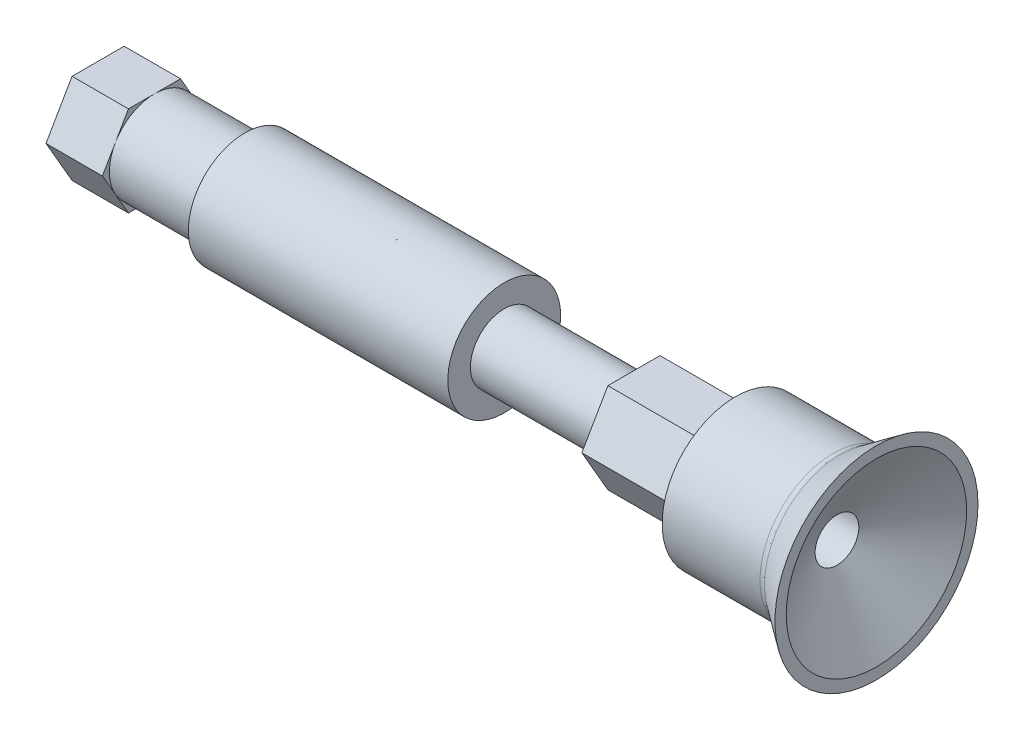
ISO-10303-21;
HEADER;
FILE_DESCRIPTION(('STEP AP214'),'2;1');
FILE_NAME('part.step','',(''),(''),'','','');
FILE_SCHEMA(('AUTOMOTIVE_DESIGN { 1 0 10303 214 1 1 1 1 }'));
ENDSEC;
DATA;
#1=APPLICATION_CONTEXT('core data for automotive mechanical design processes');
#2=APPLICATION_PROTOCOL_DEFINITION('international standard','automotive_design',2000,#1);
#3=PRODUCT_CONTEXT('',#1,'mechanical');
#4=PRODUCT('Part','Part','',(#3));
#5=PRODUCT_RELATED_PRODUCT_CATEGORY('part','',(#4));
#6=PRODUCT_DEFINITION_FORMATION('','',#4);
#7=PRODUCT_DEFINITION_CONTEXT('part definition',#1,'design');
#8=PRODUCT_DEFINITION('design','',#6,#7);
#9=PRODUCT_DEFINITION_SHAPE('','',#8);
#10=(LENGTH_UNIT() NAMED_UNIT(*) SI_UNIT(.MILLI.,.METRE.));
#11=(NAMED_UNIT(*) PLANE_ANGLE_UNIT() SI_UNIT($,.RADIAN.));
#12=(NAMED_UNIT(*) SI_UNIT($,.STERADIAN.) SOLID_ANGLE_UNIT());
#13=UNCERTAINTY_MEASURE_WITH_UNIT(LENGTH_MEASURE(1.E-05),#10,'distance_accuracy_value','');
#14=(GEOMETRIC_REPRESENTATION_CONTEXT(3) GLOBAL_UNCERTAINTY_ASSIGNED_CONTEXT((#13)) GLOBAL_UNIT_ASSIGNED_CONTEXT((#10,
#11,#12)) REPRESENTATION_CONTEXT('',''));
#15=CARTESIAN_POINT('',(0.,0.,0.));
#16=DIRECTION('',(0.,0.,1.));
#17=DIRECTION('',(1.,0.,0.));
#18=AXIS2_PLACEMENT_3D('',#15,#16,#17);
#19=CARTESIAN_POINT('',(36.,0.,0.));
#20=DIRECTION('',(1.,0.,0.));
#21=DIRECTION('',(0.,0.,-1.));
#22=AXIS2_PLACEMENT_3D('',#19,#20,#21);
#23=PLANE('',#22);
#24=CARTESIAN_POINT('',(36.,0.,0.));
#25=DIRECTION('',(1.,0.,0.));
#26=DIRECTION('',(0.,0.,-1.));
#27=AXIS2_PLACEMENT_3D('',#24,#25,#26);
#28=CIRCLE('',#27,5.);
#29=CARTESIAN_POINT('',(36.,0.,-5.));
#30=VERTEX_POINT('',#29);
#31=EDGE_CURVE('E208',#30,#30,#28,.T.);
#32=ORIENTED_EDGE('',*,*,#31,.T.);
#33=EDGE_LOOP('',(#32));
#34=FACE_BOUND('',#33,.T.);
#35=CARTESIAN_POINT('',(36.,0.,0.));
#36=DIRECTION('',(1.,0.,0.));
#37=DIRECTION('',(0.,0.,-1.));
#38=AXIS2_PLACEMENT_3D('',#35,#36,#37);
#39=CIRCLE('',#38,3.);
#40=CARTESIAN_POINT('',(36.,0.,-3.));
#41=VERTEX_POINT('',#40);
#42=EDGE_CURVE('E201',#41,#41,#39,.T.);
#43=ORIENTED_EDGE('',*,*,#42,.F.);
#44=EDGE_LOOP('',(#43));
#45=FACE_BOUND('',#44,.T.);
#46=ADVANCED_FACE('F37',(#34,#45),#23,.T.);
#47=CARTESIAN_POINT('',(5.,0.,0.));
#48=DIRECTION('',(1.,0.,0.));
#49=DIRECTION('',(0.,0.,-1.));
#50=AXIS2_PLACEMENT_3D('',#47,#48,#49);
#51=PLANE('',#50);
#52=CARTESIAN_POINT('',(5.,0.,0.));
#53=DIRECTION('',(1.,0.,0.));
#54=DIRECTION('',(0.,0.,-1.));
#55=AXIS2_PLACEMENT_3D('',#52,#53,#54);
#56=CIRCLE('',#55,4.);
#57=CARTESIAN_POINT('',(5.,2.,-3.46410161513776));
#58=VERTEX_POINT('',#57);
#59=CARTESIAN_POINT('',(5.,4.,0.));
#60=VERTEX_POINT('',#59);
#61=EDGE_CURVE('E211',#58,#60,#56,.T.);
#62=ORIENTED_EDGE('',*,*,#61,.F.);
#63=DIRECTION('',(0.,0.866025403784439,0.5));
#64=VECTOR('',#63,1.);
#65=CARTESIAN_POINT('',(5.,0.,-4.618802153517));
#66=LINE('',#65,#64);
#67=CARTESIAN_POINT('',(5.,4.,-2.3094010767585));
#68=VERTEX_POINT('',#67);
#69=EDGE_CURVE('E224',#58,#68,#66,.T.);
#70=ORIENTED_EDGE('',*,*,#69,.T.);
#71=DIRECTION('',(0.,0.,1.));
#72=VECTOR('',#71,1.);
#73=CARTESIAN_POINT('',(5.,4.,-2.3094010767585));
#74=LINE('',#73,#72);
#75=EDGE_CURVE('E225',#68,#60,#74,.T.);
#76=ORIENTED_EDGE('',*,*,#75,.T.);
#77=EDGE_LOOP('',(#62,#70,#76));
#78=FACE_BOUND('',#77,.T.);
#79=ADVANCED_FACE('F284',(#78),#51,.T.);
#80=CARTESIAN_POINT('',(5.,2.,3.46410161513775));
#81=VERTEX_POINT('',#80);
#82=EDGE_CURVE('E220',#60,#81,#56,.T.);
#83=ORIENTED_EDGE('',*,*,#82,.F.);
#84=CARTESIAN_POINT('',(5.,4.,2.3094010767585));
#85=VERTEX_POINT('',#84);
#86=EDGE_CURVE('E223',#60,#85,#74,.T.);
#87=ORIENTED_EDGE('',*,*,#86,.T.);
#88=DIRECTION('',(0.,-0.866025403784439,0.5));
#89=VECTOR('',#88,1.);
#90=CARTESIAN_POINT('',(5.,4.,2.3094010767585));
#91=LINE('',#90,#89);
#92=EDGE_CURVE('E229',#85,#81,#91,.T.);
#93=ORIENTED_EDGE('',*,*,#92,.T.);
#94=EDGE_LOOP('',(#83,#87,#93));
#95=FACE_BOUND('',#94,.T.);
#96=ADVANCED_FACE('F309',(#95),#51,.T.);
#97=CARTESIAN_POINT('',(5.,-2.,3.46410161513775));
#98=VERTEX_POINT('',#97);
#99=EDGE_CURVE('E276',#81,#98,#56,.T.);
#100=ORIENTED_EDGE('',*,*,#99,.F.);
#101=CARTESIAN_POINT('',(5.,0.,4.618802153517));
#102=VERTEX_POINT('',#101);
#103=EDGE_CURVE('E228',#81,#102,#91,.T.);
#104=ORIENTED_EDGE('',*,*,#103,.T.);
#105=DIRECTION('',(0.,-0.866025403784439,-0.5));
#106=VECTOR('',#105,1.);
#107=CARTESIAN_POINT('',(5.,0.,4.618802153517));
#108=LINE('',#107,#106);
#109=EDGE_CURVE('E233',#102,#98,#108,.T.);
#110=ORIENTED_EDGE('',*,*,#109,.T.);
#111=EDGE_LOOP('',(#100,#104,#110));
#112=FACE_BOUND('',#111,.T.);
#113=ADVANCED_FACE('F311',(#112),#51,.T.);
#114=CARTESIAN_POINT('',(5.,-4.,0.));
#115=VERTEX_POINT('',#114);
#116=EDGE_CURVE('E279',#98,#115,#56,.T.);
#117=ORIENTED_EDGE('',*,*,#116,.F.);
#118=CARTESIAN_POINT('',(5.,-4.,2.3094010767585));
#119=VERTEX_POINT('',#118);
#120=EDGE_CURVE('E232',#98,#119,#108,.T.);
#121=ORIENTED_EDGE('',*,*,#120,.T.);
#122=DIRECTION('',(0.,0.,-1.));
#123=VECTOR('',#122,1.);
#124=CARTESIAN_POINT('',(5.,-4.,2.3094010767585));
#125=LINE('',#124,#123);
#126=EDGE_CURVE('E237',#119,#115,#125,.T.);
#127=ORIENTED_EDGE('',*,*,#126,.T.);
#128=EDGE_LOOP('',(#117,#121,#127));
#129=FACE_BOUND('',#128,.T.);
#130=ADVANCED_FACE('F317',(#129),#51,.T.);
#131=CARTESIAN_POINT('',(5.,-2.,-3.46410161513775));
#132=VERTEX_POINT('',#131);
#133=EDGE_CURVE('E60',#115,#132,#56,.T.);
#134=ORIENTED_EDGE('',*,*,#133,.F.);
#135=CARTESIAN_POINT('',(5.,-4.,-2.3094010767585));
#136=VERTEX_POINT('',#135);
#137=EDGE_CURVE('E236',#115,#136,#125,.T.);
#138=ORIENTED_EDGE('',*,*,#137,.T.);
#139=DIRECTION('',(0.,0.866025403784439,-0.5));
#140=VECTOR('',#139,1.);
#141=CARTESIAN_POINT('',(5.,-4.,-2.3094010767585));
#142=LINE('',#141,#140);
#143=EDGE_CURVE('E241',#136,#132,#142,.T.);
#144=ORIENTED_EDGE('',*,*,#143,.T.);
#145=EDGE_LOOP('',(#134,#138,#144));
#146=FACE_BOUND('',#145,.T.);
#147=ADVANCED_FACE('F351',(#146),#51,.T.);
#148=CARTESIAN_POINT('',(5.,0.,-4.618802153517));
#149=DIRECTION('',(0.,-0.5,0.866025403784439));
#150=DIRECTION('',(0.,-0.866025403784439,-0.5));
#151=AXIS2_PLACEMENT_3D('',#148,#149,#150);
#152=PLANE('',#151);
#153=DIRECTION('',(0.,0.866025403784439,0.5));
#154=VECTOR('',#153,1.);
#155=CARTESIAN_POINT('',(0.,0.,-4.618802153517));
#156=LINE('',#155,#154);
#157=CARTESIAN_POINT('',(0.,0.,-4.618802153517));
#158=VERTEX_POINT('',#157);
#159=CARTESIAN_POINT('',(0.,4.,-2.3094010767585));
#160=VERTEX_POINT('',#159);
#161=EDGE_CURVE('E217',#158,#160,#156,.T.);
#162=ORIENTED_EDGE('',*,*,#161,.T.);
#163=DIRECTION('',(-1.,0.,0.));
#164=VECTOR('',#163,1.);
#165=CARTESIAN_POINT('',(5.,4.,-2.3094010767585));
#166=LINE('',#165,#164);
#167=EDGE_CURVE('E270',#68,#160,#166,.T.);
#168=ORIENTED_EDGE('',*,*,#167,.F.);
#169=ORIENTED_EDGE('',*,*,#69,.F.);
#170=CARTESIAN_POINT('',(5.,0.,-4.618802153517));
#171=VERTEX_POINT('',#170);
#172=EDGE_CURVE('E221',#171,#58,#66,.T.);
#173=ORIENTED_EDGE('',*,*,#172,.F.);
#174=DIRECTION('',(-1.,0.,0.));
#175=VECTOR('',#174,1.);
#176=CARTESIAN_POINT('',(5.,0.,-4.618802153517));
#177=LINE('',#176,#175);
#178=EDGE_CURVE('E243',#171,#158,#177,.T.);
#179=ORIENTED_EDGE('',*,*,#178,.T.);
#180=EDGE_LOOP('',(#162,#168,#169,#173,#179));
#181=FACE_BOUND('',#180,.T.);
#182=ADVANCED_FACE('F293',(#181),#152,.F.);
#183=CARTESIAN_POINT('',(5.,4.,-2.3094010767585));
#184=DIRECTION('',(0.,-1.,0.));
#185=DIRECTION('',(0.,0.,-1.));
#186=AXIS2_PLACEMENT_3D('',#183,#184,#185);
#187=PLANE('',#186);
#188=DIRECTION('',(0.,0.,1.));
#189=VECTOR('',#188,1.);
#190=CARTESIAN_POINT('',(0.,4.,-2.3094010767585));
#191=LINE('',#190,#189);
#192=CARTESIAN_POINT('',(0.,4.,2.3094010767585));
#193=VERTEX_POINT('',#192);
#194=EDGE_CURVE('E246',#160,#193,#191,.T.);
#195=ORIENTED_EDGE('',*,*,#194,.T.);
#196=DIRECTION('',(-1.,0.,0.));
#197=VECTOR('',#196,1.);
#198=CARTESIAN_POINT('',(5.,4.,2.3094010767585));
#199=LINE('',#198,#197);
#200=EDGE_CURVE('E267',#85,#193,#199,.T.);
#201=ORIENTED_EDGE('',*,*,#200,.F.);
#202=ORIENTED_EDGE('',*,*,#86,.F.);
#203=ORIENTED_EDGE('',*,*,#75,.F.);
#204=ORIENTED_EDGE('',*,*,#167,.T.);
#205=EDGE_LOOP('',(#195,#201,#202,#203,#204));
#206=FACE_BOUND('',#205,.T.);
#207=ADVANCED_FACE('F290',(#206),#187,.F.);
#208=CARTESIAN_POINT('',(5.,4.,2.3094010767585));
#209=DIRECTION('',(0.,-0.5,-0.866025403784439));
#210=DIRECTION('',(0.,0.866025403784439,-0.5));
#211=AXIS2_PLACEMENT_3D('',#208,#209,#210);
#212=PLANE('',#211);
#213=DIRECTION('',(0.,-0.866025403784439,0.5));
#214=VECTOR('',#213,1.);
#215=CARTESIAN_POINT('',(0.,4.,2.3094010767585));
#216=LINE('',#215,#214);
#217=CARTESIAN_POINT('',(0.,0.,4.618802153517));
#218=VERTEX_POINT('',#217);
#219=EDGE_CURVE('E248',#193,#218,#216,.T.);
#220=ORIENTED_EDGE('',*,*,#219,.T.);
#221=DIRECTION('',(-1.,0.,0.));
#222=VECTOR('',#221,1.);
#223=CARTESIAN_POINT('',(5.,0.,4.618802153517));
#224=LINE('',#223,#222);
#225=EDGE_CURVE('E264',#102,#218,#224,.T.);
#226=ORIENTED_EDGE('',*,*,#225,.F.);
#227=ORIENTED_EDGE('',*,*,#103,.F.);
#228=ORIENTED_EDGE('',*,*,#92,.F.);
#229=ORIENTED_EDGE('',*,*,#200,.T.);
#230=EDGE_LOOP('',(#220,#226,#227,#228,#229));
#231=FACE_BOUND('',#230,.T.);
#232=ADVANCED_FACE('F305',(#231),#212,.F.);
#233=CARTESIAN_POINT('',(5.,0.,4.618802153517));
#234=DIRECTION('',(0.,0.5,-0.866025403784439));
#235=DIRECTION('',(0.,0.866025403784439,0.5));
#236=AXIS2_PLACEMENT_3D('',#233,#234,#235);
#237=PLANE('',#236);
#238=DIRECTION('',(0.,-0.866025403784439,-0.5));
#239=VECTOR('',#238,1.);
#240=CARTESIAN_POINT('',(0.,0.,4.618802153517));
#241=LINE('',#240,#239);
#242=CARTESIAN_POINT('',(0.,-4.,2.3094010767585));
#243=VERTEX_POINT('',#242);
#244=EDGE_CURVE('E250',#218,#243,#241,.T.);
#245=ORIENTED_EDGE('',*,*,#244,.T.);
#246=DIRECTION('',(-1.,0.,0.));
#247=VECTOR('',#246,1.);
#248=CARTESIAN_POINT('',(5.,-4.,2.3094010767585));
#249=LINE('',#248,#247);
#250=EDGE_CURVE('E261',#119,#243,#249,.T.);
#251=ORIENTED_EDGE('',*,*,#250,.F.);
#252=ORIENTED_EDGE('',*,*,#120,.F.);
#253=ORIENTED_EDGE('',*,*,#109,.F.);
#254=ORIENTED_EDGE('',*,*,#225,.T.);
#255=EDGE_LOOP('',(#245,#251,#252,#253,#254));
#256=FACE_BOUND('',#255,.T.);
#257=ADVANCED_FACE('F360',(#256),#237,.F.);
#258=CARTESIAN_POINT('',(5.,-4.,2.3094010767585));
#259=DIRECTION('',(0.,1.,0.));
#260=DIRECTION('',(0.,0.,1.));
#261=AXIS2_PLACEMENT_3D('',#258,#259,#260);
#262=PLANE('',#261);
#263=DIRECTION('',(0.,0.,-1.));
#264=VECTOR('',#263,1.);
#265=CARTESIAN_POINT('',(0.,-4.,2.3094010767585));
#266=LINE('',#265,#264);
#267=CARTESIAN_POINT('',(0.,-4.,-2.3094010767585));
#268=VERTEX_POINT('',#267);
#269=EDGE_CURVE('E252',#243,#268,#266,.T.);
#270=ORIENTED_EDGE('',*,*,#269,.T.);
#271=DIRECTION('',(-1.,0.,0.));
#272=VECTOR('',#271,1.);
#273=CARTESIAN_POINT('',(5.,-4.,-2.3094010767585));
#274=LINE('',#273,#272);
#275=EDGE_CURVE('E258',#136,#268,#274,.T.);
#276=ORIENTED_EDGE('',*,*,#275,.F.);
#277=ORIENTED_EDGE('',*,*,#137,.F.);
#278=ORIENTED_EDGE('',*,*,#126,.F.);
#279=ORIENTED_EDGE('',*,*,#250,.T.);
#280=EDGE_LOOP('',(#270,#276,#277,#278,#279));
#281=FACE_BOUND('',#280,.T.);
#282=ADVANCED_FACE('F356',(#281),#262,.F.);
#283=CARTESIAN_POINT('',(5.,-4.,-2.3094010767585));
#284=DIRECTION('',(0.,0.5,0.866025403784439));
#285=DIRECTION('',(0.,-0.866025403784439,0.5));
#286=AXIS2_PLACEMENT_3D('',#283,#284,#285);
#287=PLANE('',#286);
#288=DIRECTION('',(0.,0.866025403784439,-0.5));
#289=VECTOR('',#288,1.);
#290=CARTESIAN_POINT('',(0.,-4.,-2.3094010767585));
#291=LINE('',#290,#289);
#292=EDGE_CURVE('E254',#268,#158,#291,.T.);
#293=ORIENTED_EDGE('',*,*,#292,.T.);
#294=ORIENTED_EDGE('',*,*,#178,.F.);
#295=EDGE_CURVE('E240',#132,#171,#142,.T.);
#296=ORIENTED_EDGE('',*,*,#295,.F.);
#297=ORIENTED_EDGE('',*,*,#143,.F.);
#298=ORIENTED_EDGE('',*,*,#275,.T.);
#299=EDGE_LOOP('',(#293,#294,#296,#297,#298));
#300=FACE_BOUND('',#299,.T.);
#301=ADVANCED_FACE('F350',(#300),#287,.F.);
#302=EDGE_CURVE('E52',#132,#58,#56,.T.);
#303=ORIENTED_EDGE('',*,*,#302,.F.);
#304=ORIENTED_EDGE('',*,*,#295,.T.);
#305=ORIENTED_EDGE('',*,*,#172,.T.);
#306=EDGE_LOOP('',(#303,#304,#305));
#307=FACE_BOUND('',#306,.T.);
#308=ADVANCED_FACE('F319',(#307),#51,.T.);
#309=CARTESIAN_POINT('',(0.,0.,0.));
#310=DIRECTION('',(1.,0.,0.));
#311=DIRECTION('',(0.,0.,-1.));
#312=AXIS2_PLACEMENT_3D('',#309,#310,#311);
#313=PLANE('',#312);
#314=CARTESIAN_POINT('',(0.,0.,0.));
#315=DIRECTION('',(-1.,0.,0.));
#316=DIRECTION('',(0.,0.,1.));
#317=AXIS2_PLACEMENT_3D('',#314,#315,#316);
#318=CIRCLE('',#317,2.5);
#319=CARTESIAN_POINT('',(0.,0.,2.5));
#320=VERTEX_POINT('',#319);
#321=EDGE_CURVE('E627',#320,#320,#318,.T.);
#322=ORIENTED_EDGE('',*,*,#321,.F.);
#323=EDGE_LOOP('',(#322));
#324=FACE_BOUND('',#323,.T.);
#325=ORIENTED_EDGE('',*,*,#161,.F.);
#326=ORIENTED_EDGE('',*,*,#292,.F.);
#327=ORIENTED_EDGE('',*,*,#269,.F.);
#328=ORIENTED_EDGE('',*,*,#244,.F.);
#329=ORIENTED_EDGE('',*,*,#219,.F.);
#330=ORIENTED_EDGE('',*,*,#194,.F.);
#331=EDGE_LOOP('',(#325,#326,#327,#328,#329,#330));
#332=FACE_BOUND('',#331,.T.);
#333=ADVANCED_FACE('F299',(#324,#332),#313,.F.);
#334=CARTESIAN_POINT('',(13.,0.,0.));
#335=DIRECTION('',(-1.,0.,0.));
#336=DIRECTION('',(0.,0.,1.));
#337=AXIS2_PLACEMENT_3D('',#334,#335,#336);
#338=CYLINDRICAL_SURFACE('',#337,4.);
#339=CARTESIAN_POINT('',(13.,0.,0.));
#340=DIRECTION('',(1.,0.,0.));
#341=DIRECTION('',(0.,0.,-1.));
#342=AXIS2_PLACEMENT_3D('',#339,#340,#341);
#343=CIRCLE('',#342,4.);
#344=CARTESIAN_POINT('',(13.,0.,-4.));
#345=VERTEX_POINT('',#344);
#346=EDGE_CURVE('E214',#345,#345,#343,.T.);
#347=ORIENTED_EDGE('',*,*,#346,.F.);
#348=EDGE_LOOP('',(#347));
#349=FACE_BOUND('',#348,.T.);
#350=ORIENTED_EDGE('',*,*,#61,.T.);
#351=ORIENTED_EDGE('',*,*,#82,.T.);
#352=ORIENTED_EDGE('',*,*,#99,.T.);
#353=ORIENTED_EDGE('',*,*,#116,.T.);
#354=ORIENTED_EDGE('',*,*,#133,.T.);
#355=ORIENTED_EDGE('',*,*,#302,.T.);
#356=EDGE_LOOP('',(#350,#351,#352,#353,#354,#355));
#357=FACE_BOUND('',#356,.T.);
#358=ADVANCED_FACE('F281',(#349,#357),#338,.T.);
#359=CARTESIAN_POINT('',(13.,0.,0.));
#360=DIRECTION('',(1.,0.,0.));
#361=DIRECTION('',(0.,0.,-1.));
#362=AXIS2_PLACEMENT_3D('',#359,#360,#361);
#363=PLANE('',#362);
#364=CARTESIAN_POINT('',(13.,0.,0.));
#365=DIRECTION('',(1.,0.,0.));
#366=DIRECTION('',(0.,0.,-1.));
#367=AXIS2_PLACEMENT_3D('',#364,#365,#366);
#368=CIRCLE('',#367,5.);
#369=CARTESIAN_POINT('',(13.,0.,-5.));
#370=VERTEX_POINT('',#369);
#371=EDGE_CURVE('E205',#370,#370,#368,.T.);
#372=ORIENTED_EDGE('',*,*,#371,.F.);
#373=EDGE_LOOP('',(#372));
#374=FACE_BOUND('',#373,.T.);
#375=ORIENTED_EDGE('',*,*,#346,.T.);
#376=EDGE_LOOP('',(#375));
#377=FACE_BOUND('',#376,.T.);
#378=ADVANCED_FACE('F332',(#374,#377),#363,.F.);
#379=CARTESIAN_POINT('',(36.,0.,0.));
#380=DIRECTION('',(-1.,0.,0.));
#381=DIRECTION('',(0.,0.,1.));
#382=AXIS2_PLACEMENT_3D('',#379,#380,#381);
#383=CYLINDRICAL_SURFACE('',#382,5.);
#384=ORIENTED_EDGE('',*,*,#31,.F.);
#385=EDGE_LOOP('',(#384));
#386=FACE_BOUND('',#385,.T.);
#387=ORIENTED_EDGE('',*,*,#371,.T.);
#388=EDGE_LOOP('',(#387));
#389=FACE_BOUND('',#388,.T.);
#390=ADVANCED_FACE('F335',(#386,#389),#383,.T.);
#391=CARTESIAN_POINT('',(47.5,0.,0.));
#392=DIRECTION('',(-1.,0.,0.));
#393=DIRECTION('',(0.,0.,1.));
#394=AXIS2_PLACEMENT_3D('',#391,#392,#393);
#395=CYLINDRICAL_SURFACE('',#394,3.);
#396=CARTESIAN_POINT('',(47.5,0.,0.));
#397=DIRECTION('',(1.,0.,0.));
#398=DIRECTION('',(0.,0.,-1.));
#399=AXIS2_PLACEMENT_3D('',#396,#397,#398);
#400=CIRCLE('',#399,3.);
#401=CARTESIAN_POINT('',(47.5,0.,-3.));
#402=VERTEX_POINT('',#401);
#403=EDGE_CURVE('E202',#402,#402,#400,.T.);
#404=ORIENTED_EDGE('',*,*,#403,.F.);
#405=EDGE_LOOP('',(#404));
#406=FACE_BOUND('',#405,.T.);
#407=ORIENTED_EDGE('',*,*,#42,.T.);
#408=EDGE_LOOP('',(#407));
#409=FACE_BOUND('',#408,.T.);
#410=ADVANCED_FACE('F330',(#406,#409),#395,.T.);
#411=CARTESIAN_POINT('',(47.5,0.,0.));
#412=DIRECTION('',(1.,0.,0.));
#413=DIRECTION('',(0.,0.,-1.));
#414=AXIS2_PLACEMENT_3D('',#411,#412,#413);
#415=PLANE('',#414);
#416=DIRECTION('',(0.,0.866025403784439,0.5));
#417=VECTOR('',#416,1.);
#418=CARTESIAN_POINT('',(47.5,0.,-4.618802153517));
#419=LINE('',#418,#417);
#420=CARTESIAN_POINT('',(47.5,0.,-4.618802153517));
#421=VERTEX_POINT('',#420);
#422=CARTESIAN_POINT('',(47.5,4.,-2.3094010767585));
#423=VERTEX_POINT('',#422);
#424=EDGE_CURVE('E178',#421,#423,#419,.T.);
#425=ORIENTED_EDGE('',*,*,#424,.F.);
#426=DIRECTION('',(0.,0.866025403784439,-0.5));
#427=VECTOR('',#426,1.);
#428=CARTESIAN_POINT('',(47.5,-4.,-2.3094010767585));
#429=LINE('',#428,#427);
#430=CARTESIAN_POINT('',(47.5,-4.,-2.3094010767585));
#431=VERTEX_POINT('',#430);
#432=EDGE_CURVE('E158',#431,#421,#429,.T.);
#433=ORIENTED_EDGE('',*,*,#432,.F.);
#434=DIRECTION('',(0.,0.,-1.));
#435=VECTOR('',#434,1.);
#436=CARTESIAN_POINT('',(47.5,-4.,2.3094010767585));
#437=LINE('',#436,#435);
#438=CARTESIAN_POINT('',(47.5,-4.,2.3094010767585));
#439=VERTEX_POINT('',#438);
#440=EDGE_CURVE('E187',#439,#431,#437,.T.);
#441=ORIENTED_EDGE('',*,*,#440,.F.);
#442=DIRECTION('',(0.,-0.866025403784439,-0.5));
#443=VECTOR('',#442,1.);
#444=CARTESIAN_POINT('',(47.5,0.,4.618802153517));
#445=LINE('',#444,#443);
#446=CARTESIAN_POINT('',(47.5,0.,4.618802153517));
#447=VERTEX_POINT('',#446);
#448=EDGE_CURVE('E185',#447,#439,#445,.T.);
#449=ORIENTED_EDGE('',*,*,#448,.F.);
#450=DIRECTION('',(0.,-0.866025403784439,0.5));
#451=VECTOR('',#450,1.);
#452=CARTESIAN_POINT('',(47.5,4.,2.3094010767585));
#453=LINE('',#452,#451);
#454=CARTESIAN_POINT('',(47.5,4.,2.3094010767585));
#455=VERTEX_POINT('',#454);
#456=EDGE_CURVE('E183',#455,#447,#453,.T.);
#457=ORIENTED_EDGE('',*,*,#456,.F.);
#458=DIRECTION('',(0.,0.,1.));
#459=VECTOR('',#458,1.);
#460=CARTESIAN_POINT('',(47.5,4.,-2.3094010767585));
#461=LINE('',#460,#459);
#462=EDGE_CURVE('E180',#423,#455,#461,.T.);
#463=ORIENTED_EDGE('',*,*,#462,.F.);
#464=EDGE_LOOP('',(#425,#433,#441,#449,#457,#463));
#465=FACE_BOUND('',#464,.T.);
#466=ORIENTED_EDGE('',*,*,#403,.T.);
#467=EDGE_LOOP('',(#466));
#468=FACE_BOUND('',#467,.T.);
#469=ADVANCED_FACE('F428',(#465,#468),#415,.F.);
#470=CARTESIAN_POINT('',(56.5,0.,-4.618802153517));
#471=DIRECTION('',(0.,-0.5,0.866025403784439));
#472=DIRECTION('',(0.,-0.866025403784439,-0.5));
#473=AXIS2_PLACEMENT_3D('',#470,#471,#472);
#474=PLANE('',#473);
#475=ORIENTED_EDGE('',*,*,#424,.T.);
#476=DIRECTION('',(-1.,0.,0.));
#477=VECTOR('',#476,1.);
#478=CARTESIAN_POINT('',(56.5,4.,-2.3094010767585));
#479=LINE('',#478,#477);
#480=CARTESIAN_POINT('',(56.5,4.,-2.3094010767585));
#481=VERTEX_POINT('',#480);
#482=EDGE_CURVE('E153',#481,#423,#479,.T.);
#483=ORIENTED_EDGE('',*,*,#482,.F.);
#484=DIRECTION('',(0.,0.866025403784439,0.5));
#485=VECTOR('',#484,1.);
#486=CARTESIAN_POINT('',(56.5,0.,-4.618802153517));
#487=LINE('',#486,#485);
#488=CARTESIAN_POINT('',(56.5,0.,-4.618802153517));
#489=VERTEX_POINT('',#488);
#490=EDGE_CURVE('E146',#489,#481,#487,.T.);
#491=ORIENTED_EDGE('',*,*,#490,.F.);
#492=DIRECTION('',(-1.,0.,0.));
#493=VECTOR('',#492,1.);
#494=CARTESIAN_POINT('',(56.5,0.,-4.618802153517));
#495=LINE('',#494,#493);
#496=EDGE_CURVE('E150',#489,#421,#495,.T.);
#497=ORIENTED_EDGE('',*,*,#496,.T.);
#498=EDGE_LOOP('',(#475,#483,#491,#497));
#499=FACE_BOUND('',#498,.T.);
#500=ADVANCED_FACE('F149',(#499),#474,.F.);
#501=CARTESIAN_POINT('',(56.5,4.,-2.3094010767585));
#502=DIRECTION('',(0.,-1.,0.));
#503=DIRECTION('',(0.,0.,-1.));
#504=AXIS2_PLACEMENT_3D('',#501,#502,#503);
#505=PLANE('',#504);
#506=ORIENTED_EDGE('',*,*,#462,.T.);
#507=DIRECTION('',(-1.,0.,0.));
#508=VECTOR('',#507,1.);
#509=CARTESIAN_POINT('',(56.5,4.,2.3094010767585));
#510=LINE('',#509,#508);
#511=CARTESIAN_POINT('',(56.5,4.,2.3094010767585));
#512=VERTEX_POINT('',#511);
#513=EDGE_CURVE('E197',#512,#455,#510,.T.);
#514=ORIENTED_EDGE('',*,*,#513,.F.);
#515=DIRECTION('',(0.,0.,1.));
#516=VECTOR('',#515,1.);
#517=CARTESIAN_POINT('',(56.5,4.,-2.3094010767585));
#518=LINE('',#517,#516);
#519=EDGE_CURVE('E157',#481,#512,#518,.T.);
#520=ORIENTED_EDGE('',*,*,#519,.F.);
#521=ORIENTED_EDGE('',*,*,#482,.T.);
#522=EDGE_LOOP('',(#506,#514,#520,#521));
#523=FACE_BOUND('',#522,.T.);
#524=ADVANCED_FACE('F444',(#523),#505,.F.);
#525=CARTESIAN_POINT('',(56.5,4.,2.3094010767585));
#526=DIRECTION('',(0.,-0.5,-0.866025403784439));
#527=DIRECTION('',(0.,0.866025403784439,-0.5));
#528=AXIS2_PLACEMENT_3D('',#525,#526,#527);
#529=PLANE('',#528);
#530=ORIENTED_EDGE('',*,*,#456,.T.);
#531=DIRECTION('',(-1.,0.,0.));
#532=VECTOR('',#531,1.);
#533=CARTESIAN_POINT('',(56.5,0.,4.618802153517));
#534=LINE('',#533,#532);
#535=CARTESIAN_POINT('',(56.5,0.,4.618802153517));
#536=VERTEX_POINT('',#535);
#537=EDGE_CURVE('E194',#536,#447,#534,.T.);
#538=ORIENTED_EDGE('',*,*,#537,.F.);
#539=DIRECTION('',(0.,-0.866025403784439,0.5));
#540=VECTOR('',#539,1.);
#541=CARTESIAN_POINT('',(56.5,4.,2.3094010767585));
#542=LINE('',#541,#540);
#543=EDGE_CURVE('E633',#512,#536,#542,.T.);
#544=ORIENTED_EDGE('',*,*,#543,.F.);
#545=ORIENTED_EDGE('',*,*,#513,.T.);
#546=EDGE_LOOP('',(#530,#538,#544,#545));
#547=FACE_BOUND('',#546,.T.);
#548=ADVANCED_FACE('F452',(#547),#529,.F.);
#549=CARTESIAN_POINT('',(56.5,0.,4.618802153517));
#550=DIRECTION('',(0.,0.5,-0.866025403784439));
#551=DIRECTION('',(0.,0.866025403784439,0.5));
#552=AXIS2_PLACEMENT_3D('',#549,#550,#551);
#553=PLANE('',#552);
#554=ORIENTED_EDGE('',*,*,#448,.T.);
#555=DIRECTION('',(-1.,0.,0.));
#556=VECTOR('',#555,1.);
#557=CARTESIAN_POINT('',(56.5,-4.,2.3094010767585));
#558=LINE('',#557,#556);
#559=CARTESIAN_POINT('',(56.5,-4.,2.3094010767585));
#560=VERTEX_POINT('',#559);
#561=EDGE_CURVE('E191',#560,#439,#558,.T.);
#562=ORIENTED_EDGE('',*,*,#561,.F.);
#563=DIRECTION('',(0.,-0.866025403784439,-0.5));
#564=VECTOR('',#563,1.);
#565=CARTESIAN_POINT('',(56.5,0.,4.618802153517));
#566=LINE('',#565,#564);
#567=EDGE_CURVE('E174',#536,#560,#566,.T.);
#568=ORIENTED_EDGE('',*,*,#567,.F.);
#569=ORIENTED_EDGE('',*,*,#537,.T.);
#570=EDGE_LOOP('',(#554,#562,#568,#569));
#571=FACE_BOUND('',#570,.T.);
#572=ADVANCED_FACE('F461',(#571),#553,.F.);
#573=CARTESIAN_POINT('',(56.5,-4.,2.3094010767585));
#574=DIRECTION('',(0.,1.,0.));
#575=DIRECTION('',(0.,0.,1.));
#576=AXIS2_PLACEMENT_3D('',#573,#574,#575);
#577=PLANE('',#576);
#578=ORIENTED_EDGE('',*,*,#440,.T.);
#579=DIRECTION('',(-1.,0.,0.));
#580=VECTOR('',#579,1.);
#581=CARTESIAN_POINT('',(56.5,-4.,-2.3094010767585));
#582=LINE('',#581,#580);
#583=CARTESIAN_POINT('',(56.5,-4.,-2.3094010767585));
#584=VERTEX_POINT('',#583);
#585=EDGE_CURVE('E167',#584,#431,#582,.T.);
#586=ORIENTED_EDGE('',*,*,#585,.F.);
#587=DIRECTION('',(0.,0.,-1.));
#588=VECTOR('',#587,1.);
#589=CARTESIAN_POINT('',(56.5,-4.,2.3094010767585));
#590=LINE('',#589,#588);
#591=EDGE_CURVE('E172',#560,#584,#590,.T.);
#592=ORIENTED_EDGE('',*,*,#591,.F.);
#593=ORIENTED_EDGE('',*,*,#561,.T.);
#594=EDGE_LOOP('',(#578,#586,#592,#593));
#595=FACE_BOUND('',#594,.T.);
#596=ADVANCED_FACE('F470',(#595),#577,.F.);
#597=CARTESIAN_POINT('',(56.5,-4.,-2.3094010767585));
#598=DIRECTION('',(0.,0.5,0.866025403784439));
#599=DIRECTION('',(0.,-0.866025403784439,0.5));
#600=AXIS2_PLACEMENT_3D('',#597,#598,#599);
#601=PLANE('',#600);
#602=ORIENTED_EDGE('',*,*,#432,.T.);
#603=ORIENTED_EDGE('',*,*,#496,.F.);
#604=DIRECTION('',(0.,0.866025403784439,-0.5));
#605=VECTOR('',#604,1.);
#606=CARTESIAN_POINT('',(56.5,-4.,-2.3094010767585));
#607=LINE('',#606,#605);
#608=EDGE_CURVE('E164',#584,#489,#607,.T.);
#609=ORIENTED_EDGE('',*,*,#608,.F.);
#610=ORIENTED_EDGE('',*,*,#585,.T.);
#611=EDGE_LOOP('',(#602,#603,#609,#610));
#612=FACE_BOUND('',#611,.T.);
#613=ADVANCED_FACE('F162',(#612),#601,.F.);
#614=CARTESIAN_POINT('',(5.,0.,0.));
#615=DIRECTION('',(-1.,0.,0.));
#616=DIRECTION('',(0.,0.,1.));
#617=AXIS2_PLACEMENT_3D('',#614,#615,#616);
#618=CYLINDRICAL_SURFACE('',#617,2.5);
#619=CARTESIAN_POINT('',(5.,0.,0.));
#620=DIRECTION('',(-1.,0.,0.));
#621=DIRECTION('',(0.,0.,1.));
#622=AXIS2_PLACEMENT_3D('',#619,#620,#621);
#623=CIRCLE('',#622,2.5);
#624=CARTESIAN_POINT('',(5.,0.,2.5));
#625=VERTEX_POINT('',#624);
#626=EDGE_CURVE('E181',#625,#625,#623,.T.);
#627=ORIENTED_EDGE('',*,*,#626,.F.);
#628=EDGE_LOOP('',(#627));
#629=FACE_BOUND('',#628,.T.);
#630=ORIENTED_EDGE('',*,*,#321,.T.);
#631=EDGE_LOOP('',(#630));
#632=FACE_BOUND('',#631,.T.);
#633=ADVANCED_FACE('F487',(#629,#632),#618,.F.);
#634=CARTESIAN_POINT('',(5.,0.,0.));
#635=DIRECTION('',(-1.,0.,0.));
#636=DIRECTION('',(0.,0.,1.));
#637=AXIS2_PLACEMENT_3D('',#634,#635,#636);
#638=PLANE('',#637);
#639=CARTESIAN_POINT('',(5.,0.,0.));
#640=DIRECTION('',(-1.,0.,0.));
#641=DIRECTION('',(0.,0.,1.));
#642=AXIS2_PLACEMENT_3D('',#639,#640,#641);
#643=CIRCLE('',#642,2.);
#644=CARTESIAN_POINT('',(5.,0.,2.));
#645=VERTEX_POINT('',#644);
#646=EDGE_CURVE('E624',#645,#645,#643,.T.);
#647=ORIENTED_EDGE('',*,*,#646,.F.);
#648=EDGE_LOOP('',(#647));
#649=FACE_BOUND('',#648,.T.);
#650=ORIENTED_EDGE('',*,*,#626,.T.);
#651=EDGE_LOOP('',(#650));
#652=FACE_BOUND('',#651,.T.);
#653=ADVANCED_FACE('F496',(#649,#652),#638,.T.);
#654=CARTESIAN_POINT('',(13.,0.,0.));
#655=DIRECTION('',(-1.,0.,0.));
#656=DIRECTION('',(0.,0.,1.));
#657=AXIS2_PLACEMENT_3D('',#654,#655,#656);
#658=CYLINDRICAL_SURFACE('',#657,2.);
#659=CARTESIAN_POINT('',(13.,0.,0.));
#660=DIRECTION('',(-1.,0.,0.));
#661=DIRECTION('',(0.,0.,1.));
#662=AXIS2_PLACEMENT_3D('',#659,#660,#661);
#663=CIRCLE('',#662,2.);
#664=CARTESIAN_POINT('',(13.,0.,2.));
#665=VERTEX_POINT('',#664);
#666=EDGE_CURVE('E621',#665,#665,#663,.F.);
#667=ORIENTED_EDGE('',*,*,#666,.T.);
#668=EDGE_LOOP('',(#667));
#669=FACE_BOUND('',#668,.T.);
#670=ORIENTED_EDGE('',*,*,#646,.T.);
#671=EDGE_LOOP('',(#670));
#672=FACE_BOUND('',#671,.T.);
#673=ADVANCED_FACE('F506',(#669,#672),#658,.F.);
#674=CARTESIAN_POINT('',(13.,0.,0.));
#675=DIRECTION('',(-1.,0.,0.));
#676=DIRECTION('',(0.,0.,1.));
#677=AXIS2_PLACEMENT_3D('',#674,#675,#676);
#678=PLANE('',#677);
#679=CARTESIAN_POINT('',(13.,0.,0.));
#680=DIRECTION('',(-1.,0.,0.));
#681=DIRECTION('',(0.,0.,1.));
#682=AXIS2_PLACEMENT_3D('',#679,#680,#681);
#683=CIRCLE('',#682,2.5);
#684=CARTESIAN_POINT('',(13.,0.,2.5));
#685=VERTEX_POINT('',#684);
#686=EDGE_CURVE('E618',#685,#685,#683,.T.);
#687=ORIENTED_EDGE('',*,*,#686,.F.);
#688=EDGE_LOOP('',(#687));
#689=FACE_BOUND('',#688,.T.);
#690=ORIENTED_EDGE('',*,*,#666,.F.);
#691=EDGE_LOOP('',(#690));
#692=FACE_BOUND('',#691,.T.);
#693=ADVANCED_FACE('F515',(#689,#692),#678,.F.);
#694=CARTESIAN_POINT('',(56.5,0.,0.));
#695=DIRECTION('',(-1.,0.,0.));
#696=DIRECTION('',(0.,0.,1.));
#697=AXIS2_PLACEMENT_3D('',#694,#695,#696);
#698=CYLINDRICAL_SURFACE('',#697,2.5);
#699=CARTESIAN_POINT('',(65.5,0.,0.));
#700=DIRECTION('',(1.,0.,0.));
#701=DIRECTION('',(0.,0.,-1.));
#702=AXIS2_PLACEMENT_3D('',#699,#700,#701);
#703=CIRCLE('',#702,2.5);
#704=CARTESIAN_POINT('',(65.5,0.,-2.5));
#705=VERTEX_POINT('',#704);
#706=EDGE_CURVE('E602',#705,#705,#703,.T.);
#707=ORIENTED_EDGE('',*,*,#706,.T.);
#708=EDGE_LOOP('',(#707));
#709=FACE_BOUND('',#708,.T.);
#710=ORIENTED_EDGE('',*,*,#686,.T.);
#711=EDGE_LOOP('',(#710));
#712=FACE_BOUND('',#711,.T.);
#713=ADVANCED_FACE('F524',(#709,#712),#698,.F.);
#714=CARTESIAN_POINT('',(56.5,0.,0.));
#715=DIRECTION('',(1.,0.,0.));
#716=DIRECTION('',(0.,0.,-1.));
#717=AXIS2_PLACEMENT_3D('',#714,#715,#716);
#718=PLANE('',#717);
#719=CARTESIAN_POINT('',(56.5,0.,0.));
#720=DIRECTION('',(1.,0.,0.));
#721=DIRECTION('',(0.,0.,-1.));
#722=AXIS2_PLACEMENT_3D('',#719,#720,#721);
#723=CIRCLE('',#722,6.5);
#724=CARTESIAN_POINT('',(56.5,0.,-6.5));
#725=VERTEX_POINT('',#724);
#726=EDGE_CURVE('E615',#725,#725,#723,.T.);
#727=ORIENTED_EDGE('',*,*,#726,.F.);
#728=EDGE_LOOP('',(#727));
#729=FACE_BOUND('',#728,.T.);
#730=ORIENTED_EDGE('',*,*,#608,.T.);
#731=ORIENTED_EDGE('',*,*,#490,.T.);
#732=ORIENTED_EDGE('',*,*,#519,.T.);
#733=ORIENTED_EDGE('',*,*,#543,.T.);
#734=ORIENTED_EDGE('',*,*,#567,.T.);
#735=ORIENTED_EDGE('',*,*,#591,.T.);
#736=EDGE_LOOP('',(#730,#731,#732,#733,#734,#735));
#737=FACE_BOUND('',#736,.T.);
#738=ADVANCED_FACE('F169',(#729,#737),#718,.F.);
#739=CARTESIAN_POINT('',(65.5,0.,0.));
#740=DIRECTION('',(-1.,0.,0.));
#741=DIRECTION('',(0.,0.,1.));
#742=AXIS2_PLACEMENT_3D('',#739,#740,#741);
#743=CYLINDRICAL_SURFACE('',#742,6.5);
#744=CARTESIAN_POINT('',(65.1795349465915,0.,0.));
#745=DIRECTION('',(1.,0.,0.));
#746=DIRECTION('',(0.,0.,-1.));
#747=AXIS2_PLACEMENT_3D('',#744,#745,#746);
#748=CIRCLE('',#747,6.5);
#749=CARTESIAN_POINT('',(65.1795349465915,0.,-6.5));
#750=VERTEX_POINT('',#749);
#751=EDGE_CURVE('E11',#750,#750,#748,.F.);
#752=ORIENTED_EDGE('',*,*,#751,.T.);
#753=EDGE_LOOP('',(#752));
#754=FACE_BOUND('',#753,.T.);
#755=ORIENTED_EDGE('',*,*,#726,.T.);
#756=EDGE_LOOP('',(#755));
#757=FACE_BOUND('',#756,.T.);
#758=ADVANCED_FACE('F544',(#754,#757),#743,.T.);
#759=CARTESIAN_POINT('',(65.5,0.,0.));
#760=DIRECTION('',(1.,0.,0.));
#761=DIRECTION('',(0.,0.,-1.));
#762=AXIS2_PLACEMENT_3D('',#759,#760,#761);
#763=CONICAL_SURFACE('',#762,6.5,0.620249485982821);
#764=CARTESIAN_POINT('',(65.7607731403106,0.,0.));
#765=DIRECTION('',(1.,0.,0.));
#766=DIRECTION('',(0.,0.,-1.));
#767=AXIS2_PLACEMENT_3D('',#764,#765,#766);
#768=CIRCLE('',#767,6.68626652879327);
#769=CARTESIAN_POINT('',(65.7607731403106,0.,-6.68626652879327));
#770=VERTEX_POINT('',#769);
#771=EDGE_CURVE('E45',#770,#770,#768,.T.);
#772=ORIENTED_EDGE('',*,*,#771,.T.);
#773=EDGE_LOOP('',(#772));
#774=FACE_BOUND('',#773,.T.);
#775=CARTESIAN_POINT('',(69.,0.,0.));
#776=DIRECTION('',(1.,0.,0.));
#777=DIRECTION('',(0.,0.,-1.));
#778=AXIS2_PLACEMENT_3D('',#775,#776,#777);
#779=CIRCLE('',#778,9.);
#780=CARTESIAN_POINT('',(69.,0.,-9.));
#781=VERTEX_POINT('',#780);
#782=EDGE_CURVE('E609',#781,#781,#779,.T.);
#783=ORIENTED_EDGE('',*,*,#782,.F.);
#784=EDGE_LOOP('',(#783));
#785=FACE_BOUND('',#784,.T.);
#786=ADVANCED_FACE('F553',(#774,#785),#763,.T.);
#787=CARTESIAN_POINT('',(69.,0.,0.));
#788=DIRECTION('',(1.,0.,0.));
#789=DIRECTION('',(0.,0.,-1.));
#790=AXIS2_PLACEMENT_3D('',#787,#788,#789);
#791=PLANE('',#790);
#792=CARTESIAN_POINT('',(69.,0.,0.));
#793=DIRECTION('',(1.,0.,0.));
#794=DIRECTION('',(0.,0.,-1.));
#795=AXIS2_PLACEMENT_3D('',#792,#793,#794);
#796=CIRCLE('',#795,8.);
#797=CARTESIAN_POINT('',(69.,0.,-7.99999999999999));
#798=VERTEX_POINT('',#797);
#799=EDGE_CURVE('E606',#798,#798,#796,.T.);
#800=ORIENTED_EDGE('',*,*,#799,.F.);
#801=EDGE_LOOP('',(#800));
#802=FACE_BOUND('',#801,.T.);
#803=ORIENTED_EDGE('',*,*,#782,.T.);
#804=EDGE_LOOP('',(#803));
#805=FACE_BOUND('',#804,.T.);
#806=ADVANCED_FACE('F562',(#802,#805),#791,.T.);
#807=CARTESIAN_POINT('',(65.1795349465915,0.,0.));
#808=DIRECTION('',(1.,0.,0.));
#809=DIRECTION('',(0.,0.,-1.));
#810=AXIS2_PLACEMENT_3D('',#807,#808,#809);
#811=TOROIDAL_SURFACE('',#810,7.5,1.);
#812=ORIENTED_EDGE('',*,*,#751,.F.);
#813=EDGE_LOOP('',(#812));
#814=FACE_BOUND('',#813,.T.);
#815=ORIENTED_EDGE('',*,*,#771,.F.);
#816=EDGE_LOOP('',(#815));
#817=FACE_BOUND('',#816,.T.);
#818=ADVANCED_FACE('F39',(#814,#817),#811,.F.);
#819=CARTESIAN_POINT('',(69.,0.,0.));
#820=DIRECTION('',(1.,0.,0.));
#821=DIRECTION('',(0.,0.,-1.));
#822=AXIS2_PLACEMENT_3D('',#819,#820,#821);
#823=CONICAL_SURFACE('',#822,8.,1.0471975511966);
#824=CARTESIAN_POINT('',(65.5,0.,0.));
#825=DIRECTION('',(1.,0.,0.));
#826=DIRECTION('',(0.,0.,-1.));
#827=AXIS2_PLACEMENT_3D('',#824,#825,#826);
#828=CIRCLE('',#827,1.93782217350889);
#829=CARTESIAN_POINT('',(65.5,0.,-1.93782217350888));
#830=VERTEX_POINT('',#829);
#831=EDGE_CURVE('E605',#830,#830,#828,.F.);
#832=CARTESIAN_POINT('',(65.5,0.,-1.93782217350888));
#833=CARTESIAN_POINT('',(65.5364583333333,0.,-2.00096985920149));
#834=CARTESIAN_POINT('',(65.5729166666667,0.,-2.06411754489411));
#835=CARTESIAN_POINT('',(65.6458333333333,0.,-2.19041291627934));
#836=CARTESIAN_POINT('',(65.6822916666667,0.,-2.25356060197196));
#837=CARTESIAN_POINT('',(65.7552083333333,0.,-2.37985597335719));
#838=CARTESIAN_POINT('',(65.7916666666667,0.,-2.4430036590498));
#839=CARTESIAN_POINT('',(65.8645833333333,0.,-2.56929903043504));
#840=CARTESIAN_POINT('',(65.9010416666667,0.,-2.63244671612765));
#841=CARTESIAN_POINT('',(65.9739583333333,0.,-2.75874208751289));
#842=CARTESIAN_POINT('',(66.0104166666667,0.,-2.8218897732055));
#843=CARTESIAN_POINT('',(66.0833333333333,0.,-2.94818514459073));
#844=CARTESIAN_POINT('',(66.1197916666667,0.,-3.01133283028335));
#845=CARTESIAN_POINT('',(66.1927083333333,0.,-3.13762820166858));
#846=CARTESIAN_POINT('',(66.2291666666667,0.,-3.20077588736119));
#847=CARTESIAN_POINT('',(66.3020833333333,0.,-3.32707125874643));
#848=CARTESIAN_POINT('',(66.3385416666667,0.,-3.39021894443904));
#849=CARTESIAN_POINT('',(66.4114583333333,0.,-3.51651431582427));
#850=CARTESIAN_POINT('',(66.4479166666667,0.,-3.57966200151689));
#851=CARTESIAN_POINT('',(66.5208333333333,0.,-3.70595737290212));
#852=CARTESIAN_POINT('',(66.5572916666667,0.,-3.76910505859474));
#853=CARTESIAN_POINT('',(66.6302083333333,0.,-3.89540042997997));
#854=CARTESIAN_POINT('',(66.6666666666667,0.,-3.95854811567258));
#855=CARTESIAN_POINT('',(66.7395833333333,0.,-4.08484348705781));
#856=CARTESIAN_POINT('',(66.7760416666667,0.,-4.14799117275043));
#857=CARTESIAN_POINT('',(66.8489583333333,0.,-4.27428654413566));
#858=CARTESIAN_POINT('',(66.8854166666667,0.,-4.33743422982828));
#859=CARTESIAN_POINT('',(66.9583333333333,0.,-4.46372960121351));
#860=CARTESIAN_POINT('',(66.9947916666667,0.,-4.52687728690612));
#861=CARTESIAN_POINT('',(67.0677083333333,0.,-4.65317265829135));
#862=CARTESIAN_POINT('',(67.1041666666667,0.,-4.71632034398397));
#863=CARTESIAN_POINT('',(67.1770833333333,0.,-4.8426157153692));
#864=CARTESIAN_POINT('',(67.2135416666667,0.,-4.90576340106182));
#865=CARTESIAN_POINT('',(67.2864583333333,0.,-5.03205877244705));
#866=CARTESIAN_POINT('',(67.3229166666667,0.,-5.09520645813966));
#867=CARTESIAN_POINT('',(67.3958333333333,0.,-5.2215018295249));
#868=CARTESIAN_POINT('',(67.4322916666667,0.,-5.28464951521751));
#869=CARTESIAN_POINT('',(67.5052083333333,0.,-5.41094488660274));
#870=CARTESIAN_POINT('',(67.5416666666667,0.,-5.47409257229536));
#871=CARTESIAN_POINT('',(67.6145833333333,0.,-5.60038794368059));
#872=CARTESIAN_POINT('',(67.6510416666667,0.,-5.66353562937321));
#873=CARTESIAN_POINT('',(67.7239583333333,0.,-5.78983100075844));
#874=CARTESIAN_POINT('',(67.7604166666667,0.,-5.85297868645106));
#875=CARTESIAN_POINT('',(67.8333333333333,0.,-5.97927405783629));
#876=CARTESIAN_POINT('',(67.8697916666667,0.,-6.0424217435289));
#877=CARTESIAN_POINT('',(67.9427083333333,0.,-6.16871711491413));
#878=CARTESIAN_POINT('',(67.9791666666667,0.,-6.23186480060675));
#879=CARTESIAN_POINT('',(68.0520833333333,0.,-6.35816017199198));
#880=CARTESIAN_POINT('',(68.0885416666667,0.,-6.4213078576846));
#881=CARTESIAN_POINT('',(68.1614583333333,0.,-6.54760322906983));
#882=CARTESIAN_POINT('',(68.1979166666667,0.,-6.61075091476244));
#883=CARTESIAN_POINT('',(68.2708333333333,0.,-6.73704628614767));
#884=CARTESIAN_POINT('',(68.3072916666667,0.,-6.80019397184029));
#885=CARTESIAN_POINT('',(68.3802083333333,0.,-6.92648934322552));
#886=CARTESIAN_POINT('',(68.4166666666667,0.,-6.98963702891814));
#887=CARTESIAN_POINT('',(68.4895833333333,0.,-7.11593240030337));
#888=CARTESIAN_POINT('',(68.5260416666667,0.,-7.17908008599598));
#889=CARTESIAN_POINT('',(68.5989583333333,0.,-7.30537545738122));
#890=CARTESIAN_POINT('',(68.6354166666667,0.,-7.36852314307383));
#891=CARTESIAN_POINT('',(68.7083333333333,0.,-7.49481851445906));
#892=CARTESIAN_POINT('',(68.7447916666667,0.,-7.55796620015168));
#893=CARTESIAN_POINT('',(68.8177083333333,0.,-7.68426157153691));
#894=CARTESIAN_POINT('',(68.8541666666667,0.,-7.74740925722953));
#895=CARTESIAN_POINT('',(68.9270833333333,0.,-7.87370462861476));
#896=CARTESIAN_POINT('',(68.9635416666667,0.,-7.93685231430737));
#897=CARTESIAN_POINT('',(69.,0.,-7.99999999999999));
#898=B_SPLINE_CURVE_WITH_KNOTS('',3,(#832,#833,#834,#835,#836,#837,#838,#839,#840,#841,#842,
#843,#844,#845,#846,#847,#848,#849,#850,#851,#852,#853,#854,#855,#856,#857,#858,#859,#860,#861,
#862,#863,#864,#865,#866,#867,#868,#869,#870,#871,#872,#873,#874,#875,#876,#877,#878,#879,#880,
#881,#882,#883,#884,#885,#886,#887,#888,#889,#890,#891,#892,#893,#894,#895,#896,#897),
.UNSPECIFIED.,.F.,.F.,(4,2,2,2,2,2,2,2,2,2,2,2,2,2,2,2,2,2,2,2,2,2,2,2,2,2,2,2,2,2,2,2,4),(0.,
0.218749999999999,0.437499999999997,0.656250000000002,0.875000000000001,1.09375,1.3125,1.53125,
1.75,1.96875000000001,2.1875,2.40625000000001,2.62500000000001,2.84375000000001,
3.06250000000001,3.28125000000001,3.50000000000002,3.71875000000002,3.93750000000001,
4.15625000000002,4.37500000000002,4.59375000000002,4.81250000000002,5.03125000000002,
5.25000000000002,5.46875000000002,5.68750000000002,5.90625000000003,6.12500000000003,
6.34375000000003,6.56250000000003,6.78125000000003,7.00000000000004),.UNSPECIFIED.);
#899=EDGE_CURVE('BSEAM578',#830,#798,#898,.T.);
#900=ORIENTED_EDGE('',*,*,#831,.T.);
#901=ORIENTED_EDGE('',*,*,#799,.T.);
#902=ORIENTED_EDGE('',*,*,#899,.T.);
#903=ORIENTED_EDGE('',*,*,#899,.F.);
#904=EDGE_LOOP('',(#900,#902,#901,#903));
#905=FACE_BOUND('',#904,.T.);
#906=ADVANCED_FACE('F578',(#905),#823,.F.);
#907=CARTESIAN_POINT('',(65.5,0.,0.));
#908=DIRECTION('',(1.,0.,0.));
#909=DIRECTION('',(0.,0.,-1.));
#910=AXIS2_PLACEMENT_3D('',#907,#908,#909);
#911=PLANE('',#910);
#912=ORIENTED_EDGE('',*,*,#706,.F.);
#913=EDGE_LOOP('',(#912));
#914=FACE_BOUND('',#913,.T.);
#915=ORIENTED_EDGE('',*,*,#831,.F.);
#916=EDGE_LOOP('',(#915));
#917=FACE_BOUND('',#916,.T.);
#918=ADVANCED_FACE('F584',(#914,#917),#911,.F.);
#919=CLOSED_SHELL('',(#46,#79,#96,#113,#130,#147,#182,#207,#232,#257,#282,#301,#308,#333,#358,
#378,#390,#410,#469,#500,#524,#548,#572,#596,#613,#633,#653,#673,#693,#713,#738,#758,#786,#806,
#818,#906,#918));
#920=MANIFOLD_SOLID_BREP('B2',#919);
#921=ADVANCED_BREP_SHAPE_REPRESENTATION('',(#18,#920),#14);
#922=SHAPE_DEFINITION_REPRESENTATION(#9,#921);
ENDSEC;
END-ISO-10303-21;
